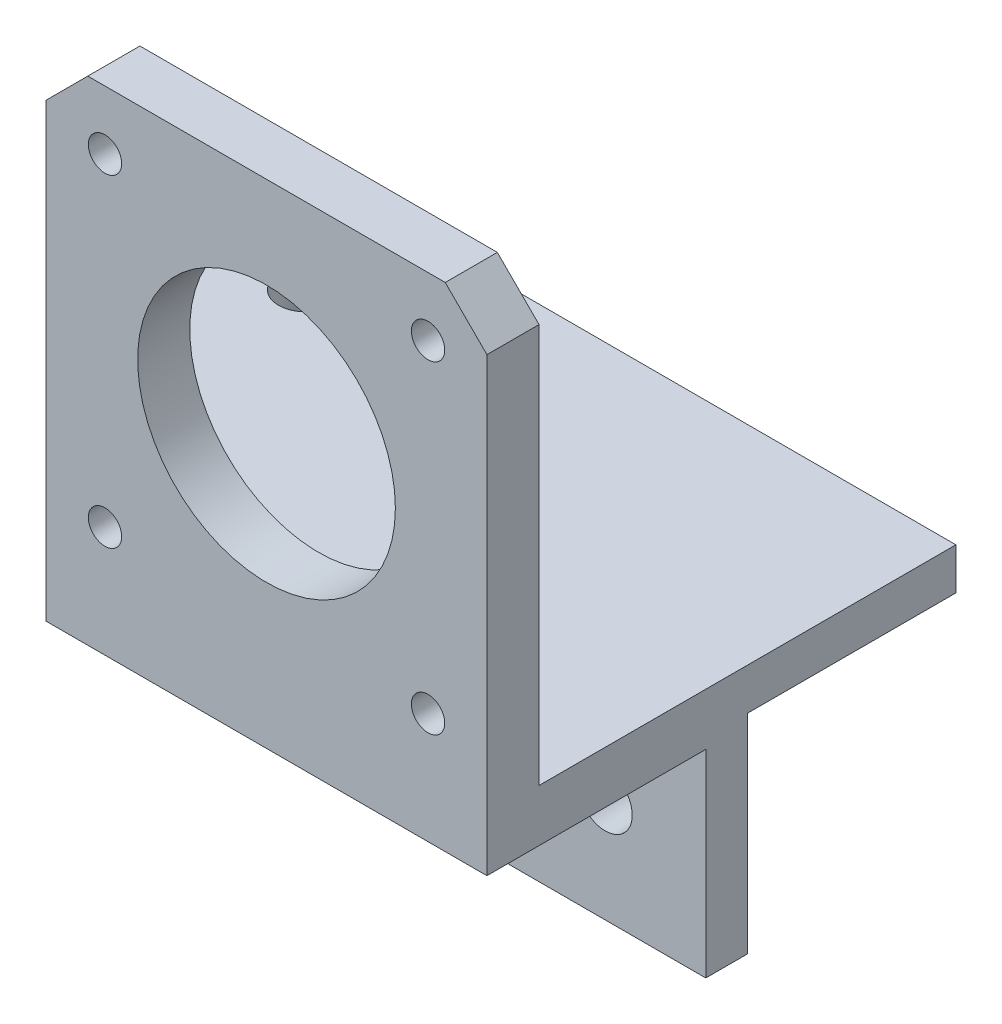
ISO-10303-21;
HEADER;
FILE_DESCRIPTION(('STEP AP214'),'2;1');
FILE_NAME('part.step','',(''),(''),'','','');
FILE_SCHEMA(('AUTOMOTIVE_DESIGN { 1 0 10303 214 1 1 1 1 }'));
ENDSEC;
DATA;
#1=APPLICATION_CONTEXT('core data for automotive mechanical design processes');
#2=APPLICATION_PROTOCOL_DEFINITION('international standard','automotive_design',2000,#1);
#3=PRODUCT_CONTEXT('',#1,'mechanical');
#4=PRODUCT('Part','Part','',(#3));
#5=PRODUCT_RELATED_PRODUCT_CATEGORY('part','',(#4));
#6=PRODUCT_DEFINITION_FORMATION('','',#4);
#7=PRODUCT_DEFINITION_CONTEXT('part definition',#1,'design');
#8=PRODUCT_DEFINITION('design','',#6,#7);
#9=PRODUCT_DEFINITION_SHAPE('','',#8);
#10=(LENGTH_UNIT() NAMED_UNIT(*) SI_UNIT(.MILLI.,.METRE.));
#11=(NAMED_UNIT(*) PLANE_ANGLE_UNIT() SI_UNIT($,.RADIAN.));
#12=(NAMED_UNIT(*) SI_UNIT($,.STERADIAN.) SOLID_ANGLE_UNIT());
#13=UNCERTAINTY_MEASURE_WITH_UNIT(LENGTH_MEASURE(1.E-05),#10,'distance_accuracy_value','');
#14=(GEOMETRIC_REPRESENTATION_CONTEXT(3) GLOBAL_UNCERTAINTY_ASSIGNED_CONTEXT((#13)) GLOBAL_UNIT_ASSIGNED_CONTEXT((#10,
#11,#12)) REPRESENTATION_CONTEXT('',''));
#15=CARTESIAN_POINT('',(0.,0.,0.));
#16=DIRECTION('',(0.,0.,1.));
#17=DIRECTION('',(1.,0.,0.));
#18=AXIS2_PLACEMENT_3D('',#15,#16,#17);
#19=CARTESIAN_POINT('',(0.,0.,0.));
#20=DIRECTION('',(0.,0.,1.));
#21=DIRECTION('',(1.,0.,0.));
#22=AXIS2_PLACEMENT_3D('',#19,#20,#21);
#23=PLANE('',#22);
#24=CARTESIAN_POINT('',(-49.6556066891385,-2.97105977085421,0.));
#25=DIRECTION('',(0.,0.,1.));
#26=DIRECTION('',(1.,0.,0.));
#27=AXIS2_PLACEMENT_3D('',#24,#25,#26);
#28=CIRCLE('',#27,2.6);
#29=CARTESIAN_POINT('',(-47.0556066891385,-2.97105977085421,0.));
#30=VERTEX_POINT('',#29);
#31=EDGE_CURVE('E176',#30,#30,#28,.T.);
#32=ORIENTED_EDGE('',*,*,#31,.T.);
#33=EDGE_LOOP('',(#32));
#34=FACE_BOUND('',#33,.T.);
#35=CARTESIAN_POINT('',(-69.6556066891385,-2.97105977085421,0.));
#36=DIRECTION('',(0.,0.,1.));
#37=DIRECTION('',(1.,0.,0.));
#38=AXIS2_PLACEMENT_3D('',#35,#36,#37);
#39=CIRCLE('',#38,2.6);
#40=CARTESIAN_POINT('',(-67.0556066891385,-2.97105977085421,0.));
#41=VERTEX_POINT('',#40);
#42=EDGE_CURVE('E170',#41,#41,#39,.T.);
#43=ORIENTED_EDGE('',*,*,#42,.T.);
#44=EDGE_LOOP('',(#43));
#45=FACE_BOUND('',#44,.T.);
#46=CARTESIAN_POINT('',(-89.6556066891385,-2.97105977085421,0.));
#47=DIRECTION('',(0.,0.,1.));
#48=DIRECTION('',(1.,0.,0.));
#49=AXIS2_PLACEMENT_3D('',#46,#47,#48);
#50=CIRCLE('',#49,2.6);
#51=CARTESIAN_POINT('',(-87.0556066891385,-2.97105977085421,0.));
#52=VERTEX_POINT('',#51);
#53=EDGE_CURVE('E163',#52,#52,#50,.T.);
#54=ORIENTED_EDGE('',*,*,#53,.T.);
#55=EDGE_LOOP('',(#54));
#56=FACE_BOUND('',#55,.T.);
#57=DIRECTION('',(-1.,0.,0.));
#58=VECTOR('',#57,1.);
#59=CARTESIAN_POINT('',(-40.,7.02894022914576,0.));
#60=LINE('',#59,#58);
#61=CARTESIAN_POINT('',(-40.,7.02894022914576,0.));
#62=VERTEX_POINT('',#61);
#63=CARTESIAN_POINT('',(-102.391596743468,7.02894022914576,0.));
#64=VERTEX_POINT('',#63);
#65=EDGE_CURVE('E48',#62,#64,#60,.T.);
#66=ORIENTED_EDGE('',*,*,#65,.F.);
#67=DIRECTION('',(0.,1.,0.));
#68=VECTOR('',#67,1.);
#69=CARTESIAN_POINT('',(-40.,-12.9710597708542,0.));
#70=LINE('',#69,#68);
#71=CARTESIAN_POINT('',(-40.,-12.9710597708542,0.));
#72=VERTEX_POINT('',#71);
#73=EDGE_CURVE('E135',#72,#62,#70,.T.);
#74=ORIENTED_EDGE('',*,*,#73,.F.);
#75=DIRECTION('',(1.,0.,0.));
#76=VECTOR('',#75,1.);
#77=CARTESIAN_POINT('',(-40.,-12.9710597708542,0.));
#78=LINE('',#77,#76);
#79=CARTESIAN_POINT('',(-102.391596743468,-12.9710597708542,0.));
#80=VERTEX_POINT('',#79);
#81=EDGE_CURVE('E131',#80,#72,#78,.T.);
#82=ORIENTED_EDGE('',*,*,#81,.F.);
#83=DIRECTION('',(0.,-1.,0.));
#84=VECTOR('',#83,1.);
#85=CARTESIAN_POINT('',(-102.391596743468,-12.9710597708542,0.));
#86=LINE('',#85,#84);
#87=EDGE_CURVE('E129',#64,#80,#86,.T.);
#88=ORIENTED_EDGE('',*,*,#87,.F.);
#89=EDGE_LOOP('',(#66,#74,#82,#88));
#90=FACE_BOUND('',#89,.T.);
#91=ADVANCED_FACE('F33',(#34,#45,#56,#90),#23,.F.);
#92=CARTESIAN_POINT('',(-40.,-12.9710597708542,4.));
#93=DIRECTION('',(-1.,0.,0.));
#94=DIRECTION('',(0.,0.,1.));
#95=AXIS2_PLACEMENT_3D('',#92,#93,#94);
#96=PLANE('',#95);
#97=ORIENTED_EDGE('',*,*,#73,.T.);
#98=DIRECTION('',(0.,0.,1.));
#99=VECTOR('',#98,1.);
#100=CARTESIAN_POINT('',(-40.,7.02894022914576,-82.5196876527666));
#101=LINE('',#100,#99);
#102=CARTESIAN_POINT('',(-40.,7.02894022914576,-20.));
#103=VERTEX_POINT('',#102);
#104=EDGE_CURVE('E145',#103,#62,#101,.T.);
#105=ORIENTED_EDGE('',*,*,#104,.F.);
#106=DIRECTION('',(0.,1.,0.));
#107=VECTOR('',#106,1.);
#108=CARTESIAN_POINT('',(-40.,11.0289402291458,-20.));
#109=LINE('',#108,#107);
#110=CARTESIAN_POINT('',(-40.,11.0289402291458,-20.));
#111=VERTEX_POINT('',#110);
#112=EDGE_CURVE('E156',#103,#111,#109,.T.);
#113=ORIENTED_EDGE('',*,*,#112,.T.);
#114=DIRECTION('',(0.,0.,-1.));
#115=VECTOR('',#114,1.);
#116=CARTESIAN_POINT('',(-40.,11.0289402291458,4.));
#117=LINE('',#116,#115);
#118=CARTESIAN_POINT('',(-40.,11.0289402291458,20.));
#119=VERTEX_POINT('',#118);
#120=EDGE_CURVE('E276',#119,#111,#117,.T.);
#121=ORIENTED_EDGE('',*,*,#120,.F.);
#122=DIRECTION('',(0.,1.,0.));
#123=VECTOR('',#122,1.);
#124=CARTESIAN_POINT('',(-40.,6.02894022914577,20.));
#125=LINE('',#124,#123);
#126=CARTESIAN_POINT('',(-40.0000000000001,49.3289402291458,20.));
#127=VERTEX_POINT('',#126);
#128=EDGE_CURVE('E209',#119,#127,#125,.T.);
#129=ORIENTED_EDGE('',*,*,#128,.T.);
#130=DIRECTION('',(0.,0.,-1.));
#131=VECTOR('',#130,1.);
#132=CARTESIAN_POINT('',(-40.0000000000001,49.3289402291458,25.));
#133=LINE('',#132,#131);
#134=CARTESIAN_POINT('',(-40.0000000000001,49.3289402291458,25.));
#135=VERTEX_POINT('',#134);
#136=EDGE_CURVE('E246',#135,#127,#133,.T.);
#137=ORIENTED_EDGE('',*,*,#136,.F.);
#138=DIRECTION('',(0.,1.,0.));
#139=VECTOR('',#138,1.);
#140=CARTESIAN_POINT('',(-40.,6.02894022914577,25.));
#141=LINE('',#140,#139);
#142=CARTESIAN_POINT('',(-40.,6.02894022914577,25.));
#143=VERTEX_POINT('',#142);
#144=EDGE_CURVE('E212',#143,#135,#141,.T.);
#145=ORIENTED_EDGE('',*,*,#144,.F.);
#146=DIRECTION('',(0.,0.,-1.));
#147=VECTOR('',#146,1.);
#148=CARTESIAN_POINT('',(-40.,6.02894022914577,62.5944832108573));
#149=LINE('',#148,#147);
#150=CARTESIAN_POINT('',(-40.,6.02894022914576,4.));
#151=VERTEX_POINT('',#150);
#152=EDGE_CURVE('E249',#143,#151,#149,.T.);
#153=ORIENTED_EDGE('',*,*,#152,.T.);
#154=DIRECTION('',(0.,1.,0.));
#155=VECTOR('',#154,1.);
#156=CARTESIAN_POINT('',(-40.,-12.9710597708542,4.));
#157=LINE('',#156,#155);
#158=CARTESIAN_POINT('',(-40.,-12.9710597708542,4.));
#159=VERTEX_POINT('',#158);
#160=EDGE_CURVE('E259',#159,#151,#157,.T.);
#161=ORIENTED_EDGE('',*,*,#160,.F.);
#162=DIRECTION('',(0.,0.,-1.));
#163=VECTOR('',#162,1.);
#164=CARTESIAN_POINT('',(-40.,-12.9710597708542,4.));
#165=LINE('',#164,#163);
#166=EDGE_CURVE('E267',#159,#72,#165,.T.);
#167=ORIENTED_EDGE('',*,*,#166,.T.);
#168=EDGE_LOOP('',(#97,#105,#113,#121,#129,#137,#145,#153,#161,#167));
#169=FACE_BOUND('',#168,.T.);
#170=ADVANCED_FACE('F303',(#169),#96,.F.);
#171=CARTESIAN_POINT('',(-40.,11.0289402291458,4.));
#172=DIRECTION('',(0.,-1.,0.));
#173=DIRECTION('',(0.,0.,-1.));
#174=AXIS2_PLACEMENT_3D('',#171,#172,#173);
#175=PLANE('',#174);
#176=CARTESIAN_POINT('',(-92.3915967434677,11.0289402291458,-10.));
#177=DIRECTION('',(0.,1.,0.));
#178=DIRECTION('',(0.,0.,1.));
#179=AXIS2_PLACEMENT_3D('',#176,#177,#178);
#180=CIRCLE('',#179,2.6);
#181=CARTESIAN_POINT('',(-92.3915967434677,11.0289402291458,-7.4));
#182=VERTEX_POINT('',#181);
#183=EDGE_CURVE('E153',#182,#182,#180,.T.);
#184=ORIENTED_EDGE('',*,*,#183,.F.);
#185=EDGE_LOOP('',(#184));
#186=FACE_BOUND('',#185,.T.);
#187=ORIENTED_EDGE('',*,*,#120,.T.);
#188=DIRECTION('',(-1.,0.,0.));
#189=VECTOR('',#188,1.);
#190=CARTESIAN_POINT('',(-40.,11.0289402291458,-20.));
#191=LINE('',#190,#189);
#192=CARTESIAN_POINT('',(-102.391596743468,11.0289402291458,-20.));
#193=VERTEX_POINT('',#192);
#194=EDGE_CURVE('E160',#111,#193,#191,.T.);
#195=ORIENTED_EDGE('',*,*,#194,.T.);
#196=DIRECTION('',(0.,0.,-1.));
#197=VECTOR('',#196,1.);
#198=CARTESIAN_POINT('',(-102.391596743468,11.0289402291458,4.));
#199=LINE('',#198,#197);
#200=CARTESIAN_POINT('',(-102.391596743468,11.0289402291458,4.));
#201=VERTEX_POINT('',#200);
#202=EDGE_CURVE('E274',#201,#193,#199,.T.);
#203=ORIENTED_EDGE('',*,*,#202,.F.);
#204=DIRECTION('',(-1.,0.,0.));
#205=VECTOR('',#204,1.);
#206=CARTESIAN_POINT('',(-40.,11.0289402291458,4.));
#207=LINE('',#206,#205);
#208=CARTESIAN_POINT('',(-98.3,11.0289402291458,4.));
#209=VERTEX_POINT('',#208);
#210=EDGE_CURVE('E261',#209,#201,#207,.T.);
#211=ORIENTED_EDGE('',*,*,#210,.F.);
#212=DIRECTION('',(0.707106781186544,0.,0.707106781186551));
#213=VECTOR('',#212,1.);
#214=CARTESIAN_POINT('',(-69.1500000000003,11.0289402291458,33.15));
#215=LINE('',#214,#213);
#216=CARTESIAN_POINT('',(-82.3,11.0289402291458,20.));
#217=VERTEX_POINT('',#216);
#218=EDGE_CURVE('E11',#209,#217,#215,.T.);
#219=ORIENTED_EDGE('',*,*,#218,.T.);
#220=DIRECTION('',(-1.,0.,0.));
#221=VECTOR('',#220,1.);
#222=CARTESIAN_POINT('',(-40.,11.0289402291458,20.));
#223=LINE('',#222,#221);
#224=EDGE_CURVE('E251',#119,#217,#223,.T.);
#225=ORIENTED_EDGE('',*,*,#224,.F.);
#226=EDGE_LOOP('',(#187,#195,#203,#211,#219,#225));
#227=FACE_BOUND('',#226,.T.);
#228=ADVANCED_FACE('F293',(#186,#227),#175,.F.);
#229=CARTESIAN_POINT('',(-102.391596743468,-12.9710597708542,4.));
#230=DIRECTION('',(1.,0.,0.));
#231=DIRECTION('',(0.,0.,-1.));
#232=AXIS2_PLACEMENT_3D('',#229,#230,#231);
#233=PLANE('',#232);
#234=ORIENTED_EDGE('',*,*,#202,.T.);
#235=DIRECTION('',(0.,-1.,0.));
#236=VECTOR('',#235,1.);
#237=CARTESIAN_POINT('',(-102.391596743468,11.0289402291458,-20.));
#238=LINE('',#237,#236);
#239=CARTESIAN_POINT('',(-102.391596743468,7.02894022914576,-20.));
#240=VERTEX_POINT('',#239);
#241=EDGE_CURVE('E142',#193,#240,#238,.T.);
#242=ORIENTED_EDGE('',*,*,#241,.T.);
#243=DIRECTION('',(0.,0.,1.));
#244=VECTOR('',#243,1.);
#245=CARTESIAN_POINT('',(-102.391596743468,7.02894022914576,-82.5196876527666));
#246=LINE('',#245,#244);
#247=EDGE_CURVE('E139',#240,#64,#246,.T.);
#248=ORIENTED_EDGE('',*,*,#247,.T.);
#249=ORIENTED_EDGE('',*,*,#87,.T.);
#250=DIRECTION('',(0.,0.,-1.));
#251=VECTOR('',#250,1.);
#252=CARTESIAN_POINT('',(-102.391596743468,-12.9710597708542,4.));
#253=LINE('',#252,#251);
#254=CARTESIAN_POINT('',(-102.391596743468,-12.9710597708542,4.));
#255=VERTEX_POINT('',#254);
#256=EDGE_CURVE('E272',#255,#80,#253,.T.);
#257=ORIENTED_EDGE('',*,*,#256,.F.);
#258=DIRECTION('',(0.,-1.,0.));
#259=VECTOR('',#258,1.);
#260=CARTESIAN_POINT('',(-102.391596743468,-12.9710597708542,4.));
#261=LINE('',#260,#259);
#262=EDGE_CURVE('E263',#201,#255,#261,.T.);
#263=ORIENTED_EDGE('',*,*,#262,.F.);
#264=EDGE_LOOP('',(#234,#242,#248,#249,#257,#263));
#265=FACE_BOUND('',#264,.T.);
#266=ADVANCED_FACE('F140',(#265),#233,.F.);
#267=CARTESIAN_POINT('',(-40.,-12.9710597708542,4.));
#268=DIRECTION('',(0.,1.,0.));
#269=DIRECTION('',(0.,0.,1.));
#270=AXIS2_PLACEMENT_3D('',#267,#268,#269);
#271=PLANE('',#270);
#272=ORIENTED_EDGE('',*,*,#81,.T.);
#273=ORIENTED_EDGE('',*,*,#166,.F.);
#274=DIRECTION('',(1.,0.,0.));
#275=VECTOR('',#274,1.);
#276=CARTESIAN_POINT('',(-40.,-12.9710597708542,4.));
#277=LINE('',#276,#275);
#278=EDGE_CURVE('E265',#255,#159,#277,.T.);
#279=ORIENTED_EDGE('',*,*,#278,.F.);
#280=ORIENTED_EDGE('',*,*,#256,.T.);
#281=EDGE_LOOP('',(#272,#273,#279,#280));
#282=FACE_BOUND('',#281,.T.);
#283=ADVANCED_FACE('F301',(#282),#271,.F.);
#284=CARTESIAN_POINT('',(0.,0.,4.));
#285=DIRECTION('',(0.,0.,1.));
#286=DIRECTION('',(1.,0.,0.));
#287=AXIS2_PLACEMENT_3D('',#284,#285,#286);
#288=PLANE('',#287);
#289=CARTESIAN_POINT('',(-89.6556066891385,-2.97105977085421,4.));
#290=DIRECTION('',(0.,0.,1.));
#291=DIRECTION('',(1.,0.,0.));
#292=AXIS2_PLACEMENT_3D('',#289,#290,#291);
#293=CIRCLE('',#292,2.6);
#294=CARTESIAN_POINT('',(-87.0556066891385,-2.97105977085421,4.));
#295=VERTEX_POINT('',#294);
#296=EDGE_CURVE('E167',#295,#295,#293,.T.);
#297=ORIENTED_EDGE('',*,*,#296,.F.);
#298=EDGE_LOOP('',(#297));
#299=FACE_BOUND('',#298,.T.);
#300=CARTESIAN_POINT('',(-69.6556066891385,-2.97105977085421,4.));
#301=DIRECTION('',(0.,0.,1.));
#302=DIRECTION('',(1.,0.,0.));
#303=AXIS2_PLACEMENT_3D('',#300,#301,#302);
#304=CIRCLE('',#303,2.6);
#305=CARTESIAN_POINT('',(-67.0556066891385,-2.97105977085421,4.));
#306=VERTEX_POINT('',#305);
#307=EDGE_CURVE('E173',#306,#306,#304,.T.);
#308=ORIENTED_EDGE('',*,*,#307,.F.);
#309=EDGE_LOOP('',(#308));
#310=FACE_BOUND('',#309,.T.);
#311=CARTESIAN_POINT('',(-49.6556066891385,-2.97105977085421,4.));
#312=DIRECTION('',(0.,0.,1.));
#313=DIRECTION('',(1.,0.,0.));
#314=AXIS2_PLACEMENT_3D('',#311,#312,#313);
#315=CIRCLE('',#314,2.6);
#316=CARTESIAN_POINT('',(-47.0556066891385,-2.97105977085421,4.));
#317=VERTEX_POINT('',#316);
#318=EDGE_CURVE('E179',#317,#317,#315,.T.);
#319=ORIENTED_EDGE('',*,*,#318,.F.);
#320=EDGE_LOOP('',(#319));
#321=FACE_BOUND('',#320,.T.);
#322=DIRECTION('',(1.,0.,0.));
#323=VECTOR('',#322,1.);
#324=CARTESIAN_POINT('',(-40.,6.02894022914577,4.));
#325=LINE('',#324,#323);
#326=CARTESIAN_POINT('',(-98.3,6.02894022914577,4.));
#327=VERTEX_POINT('',#326);
#328=EDGE_CURVE('E56',#327,#151,#325,.T.);
#329=ORIENTED_EDGE('',*,*,#328,.F.);
#330=DIRECTION('',(0.,1.,0.));
#331=VECTOR('',#330,1.);
#332=CARTESIAN_POINT('',(-98.3,0.,4.));
#333=LINE('',#332,#331);
#334=EDGE_CURVE('E281',#327,#209,#333,.T.);
#335=ORIENTED_EDGE('',*,*,#334,.T.);
#336=ORIENTED_EDGE('',*,*,#210,.T.);
#337=ORIENTED_EDGE('',*,*,#262,.T.);
#338=ORIENTED_EDGE('',*,*,#278,.T.);
#339=ORIENTED_EDGE('',*,*,#160,.T.);
#340=EDGE_LOOP('',(#329,#335,#336,#337,#338,#339));
#341=FACE_BOUND('',#340,.T.);
#342=ADVANCED_FACE('F290',(#299,#310,#321,#341),#288,.T.);
#343=CARTESIAN_POINT('',(-82.3,11.0289402291458,62.5944832108573));
#344=DIRECTION('',(1.,0.,0.));
#345=DIRECTION('',(0.,0.,-1.));
#346=AXIS2_PLACEMENT_3D('',#343,#344,#345);
#347=PLANE('',#346);
#348=DIRECTION('',(0.,-1.,0.));
#349=VECTOR('',#348,1.);
#350=CARTESIAN_POINT('',(-82.3,6.02894022914577,20.));
#351=LINE('',#350,#349);
#352=CARTESIAN_POINT('',(-82.3,49.3289402291458,20.));
#353=VERTEX_POINT('',#352);
#354=EDGE_CURVE('E216',#353,#217,#351,.T.);
#355=ORIENTED_EDGE('',*,*,#354,.T.);
#356=DIRECTION('',(0.,-1.,0.));
#357=VECTOR('',#356,1.);
#358=CARTESIAN_POINT('',(-82.3,11.0289402291458,20.0000000000001));
#359=LINE('',#358,#357);
#360=CARTESIAN_POINT('',(-82.3,6.02894022914577,20.0000000000001));
#361=VERTEX_POINT('',#360);
#362=EDGE_CURVE('E278',#217,#361,#359,.T.);
#363=ORIENTED_EDGE('',*,*,#362,.T.);
#364=DIRECTION('',(0.,0.,-1.));
#365=VECTOR('',#364,1.);
#366=CARTESIAN_POINT('',(-82.3,6.02894022914577,62.5944832108573));
#367=LINE('',#366,#365);
#368=CARTESIAN_POINT('',(-82.3,6.02894022914577,25.));
#369=VERTEX_POINT('',#368);
#370=EDGE_CURVE('E252',#369,#361,#367,.T.);
#371=ORIENTED_EDGE('',*,*,#370,.F.);
#372=DIRECTION('',(0.,-1.,0.));
#373=VECTOR('',#372,1.);
#374=CARTESIAN_POINT('',(-82.3,6.02894022914577,25.));
#375=LINE('',#374,#373);
#376=CARTESIAN_POINT('',(-82.3,49.3289402291458,25.));
#377=VERTEX_POINT('',#376);
#378=EDGE_CURVE('E222',#377,#369,#375,.T.);
#379=ORIENTED_EDGE('',*,*,#378,.F.);
#380=DIRECTION('',(0.,0.,-1.));
#381=VECTOR('',#380,1.);
#382=CARTESIAN_POINT('',(-82.3,49.3289402291458,25.));
#383=LINE('',#382,#381);
#384=EDGE_CURVE('E228',#377,#353,#383,.T.);
#385=ORIENTED_EDGE('',*,*,#384,.T.);
#386=EDGE_LOOP('',(#355,#363,#371,#379,#385));
#387=FACE_BOUND('',#386,.T.);
#388=ADVANCED_FACE('F313',(#387),#347,.F.);
#389=CARTESIAN_POINT('',(-40.,6.02894022914577,62.5944832108573));
#390=DIRECTION('',(0.,1.,0.));
#391=DIRECTION('',(-1.,0.,0.));
#392=AXIS2_PLACEMENT_3D('',#389,#390,#391);
#393=PLANE('',#392);
#394=ORIENTED_EDGE('',*,*,#152,.F.);
#395=DIRECTION('',(1.,0.,0.));
#396=VECTOR('',#395,1.);
#397=CARTESIAN_POINT('',(-40.,6.02894022914577,25.));
#398=LINE('',#397,#396);
#399=EDGE_CURVE('E225',#369,#143,#398,.T.);
#400=ORIENTED_EDGE('',*,*,#399,.F.);
#401=ORIENTED_EDGE('',*,*,#370,.T.);
#402=DIRECTION('',(-0.707106781186544,0.,-0.707106781186551));
#403=VECTOR('',#402,1.);
#404=CARTESIAN_POINT('',(-39.8527583945717,6.02894022914577,62.4472416054289));
#405=LINE('',#404,#403);
#406=EDGE_CURVE('E41',#361,#327,#405,.T.);
#407=ORIENTED_EDGE('',*,*,#406,.T.);
#408=ORIENTED_EDGE('',*,*,#328,.T.);
#409=EDGE_LOOP('',(#394,#400,#401,#407,#408));
#410=FACE_BOUND('',#409,.T.);
#411=ADVANCED_FACE('F284',(#410),#393,.F.);
#412=CARTESIAN_POINT('',(0.,0.,20.));
#413=DIRECTION('',(0.,0.,1.));
#414=DIRECTION('',(1.,0.,0.));
#415=AXIS2_PLACEMENT_3D('',#412,#413,#414);
#416=PLANE('',#415);
#417=CARTESIAN_POINT('',(-45.65,47.6789402291458,20.));
#418=DIRECTION('',(0.,0.,1.));
#419=DIRECTION('',(1.,0.,0.));
#420=AXIS2_PLACEMENT_3D('',#417,#418,#419);
#421=CIRCLE('',#420,1.6);
#422=CARTESIAN_POINT('',(-44.05,47.6789402291458,20.));
#423=VERTEX_POINT('',#422);
#424=EDGE_CURVE('E203',#423,#423,#421,.T.);
#425=ORIENTED_EDGE('',*,*,#424,.T.);
#426=EDGE_LOOP('',(#425));
#427=FACE_BOUND('',#426,.T.);
#428=CARTESIAN_POINT('',(-61.15,32.1789402291458,20.));
#429=DIRECTION('',(0.,0.,1.));
#430=DIRECTION('',(1.,0.,0.));
#431=AXIS2_PLACEMENT_3D('',#428,#429,#430);
#432=CIRCLE('',#431,12.3643409800213);
#433=CARTESIAN_POINT('',(-48.7856590199787,32.1789402291458,20.));
#434=VERTEX_POINT('',#433);
#435=EDGE_CURVE('E197',#434,#434,#432,.T.);
#436=ORIENTED_EDGE('',*,*,#435,.T.);
#437=EDGE_LOOP('',(#436));
#438=FACE_BOUND('',#437,.T.);
#439=CARTESIAN_POINT('',(-76.65,47.6789402291456,20.));
#440=DIRECTION('',(0.,0.,1.));
#441=DIRECTION('',(1.,0.,0.));
#442=AXIS2_PLACEMENT_3D('',#439,#440,#441);
#443=CIRCLE('',#442,1.6);
#444=CARTESIAN_POINT('',(-75.05,47.6789402291456,20.));
#445=VERTEX_POINT('',#444);
#446=EDGE_CURVE('E191',#445,#445,#443,.T.);
#447=ORIENTED_EDGE('',*,*,#446,.T.);
#448=EDGE_LOOP('',(#447));
#449=FACE_BOUND('',#448,.T.);
#450=CARTESIAN_POINT('',(-76.6499999999997,16.6789402291456,20.));
#451=DIRECTION('',(0.,0.,1.));
#452=DIRECTION('',(1.,0.,0.));
#453=AXIS2_PLACEMENT_3D('',#450,#451,#452);
#454=CIRCLE('',#453,1.6);
#455=CARTESIAN_POINT('',(-75.0499999999997,16.6789402291456,20.));
#456=VERTEX_POINT('',#455);
#457=EDGE_CURVE('E185',#456,#456,#454,.T.);
#458=ORIENTED_EDGE('',*,*,#457,.T.);
#459=EDGE_LOOP('',(#458));
#460=FACE_BOUND('',#459,.T.);
#461=CARTESIAN_POINT('',(-45.6499999999997,16.6789402291458,20.));
#462=DIRECTION('',(0.,0.,1.));
#463=DIRECTION('',(1.,0.,0.));
#464=AXIS2_PLACEMENT_3D('',#461,#462,#463);
#465=CIRCLE('',#464,1.6);
#466=CARTESIAN_POINT('',(-44.0499999999997,16.6789402291458,20.));
#467=VERTEX_POINT('',#466);
#468=EDGE_CURVE('E166',#467,#467,#465,.T.);
#469=ORIENTED_EDGE('',*,*,#468,.T.);
#470=EDGE_LOOP('',(#469));
#471=FACE_BOUND('',#470,.T.);
#472=ORIENTED_EDGE('',*,*,#128,.F.);
#473=ORIENTED_EDGE('',*,*,#224,.T.);
#474=ORIENTED_EDGE('',*,*,#354,.F.);
#475=DIRECTION('',(-0.707106781186547,-0.707106781186547,0.));
#476=VECTOR('',#475,1.);
#477=CARTESIAN_POINT('',(-78.3000000000001,53.3289402291457,20.));
#478=LINE('',#477,#476);
#479=CARTESIAN_POINT('',(-78.3000000000001,53.3289402291457,20.));
#480=VERTEX_POINT('',#479);
#481=EDGE_CURVE('E234',#480,#353,#478,.T.);
#482=ORIENTED_EDGE('',*,*,#481,.F.);
#483=DIRECTION('',(-1.,0.,0.));
#484=VECTOR('',#483,1.);
#485=CARTESIAN_POINT('',(-44.,53.3289402291458,20.));
#486=LINE('',#485,#484);
#487=CARTESIAN_POINT('',(-44.,53.3289402291458,20.));
#488=VERTEX_POINT('',#487);
#489=EDGE_CURVE('E232',#488,#480,#486,.T.);
#490=ORIENTED_EDGE('',*,*,#489,.F.);
#491=DIRECTION('',(-0.707106781186548,0.707106781186547,0.));
#492=VECTOR('',#491,1.);
#493=CARTESIAN_POINT('',(-40.0000000000001,49.3289402291458,20.));
#494=LINE('',#493,#492);
#495=EDGE_CURVE('E230',#127,#488,#494,.T.);
#496=ORIENTED_EDGE('',*,*,#495,.F.);
#497=EDGE_LOOP('',(#472,#473,#474,#482,#490,#496));
#498=FACE_BOUND('',#497,.T.);
#499=ADVANCED_FACE('F318',(#427,#438,#449,#460,#471,#498),#416,.F.);
#500=CARTESIAN_POINT('',(0.,0.,25.));
#501=DIRECTION('',(0.,0.,1.));
#502=DIRECTION('',(1.,0.,0.));
#503=AXIS2_PLACEMENT_3D('',#500,#501,#502);
#504=PLANE('',#503);
#505=CARTESIAN_POINT('',(-76.6499999999997,16.6789402291456,25.));
#506=DIRECTION('',(0.,0.,1.));
#507=DIRECTION('',(1.,0.,0.));
#508=AXIS2_PLACEMENT_3D('',#505,#506,#507);
#509=CIRCLE('',#508,1.6);
#510=CARTESIAN_POINT('',(-75.0499999999997,16.6789402291456,25.));
#511=VERTEX_POINT('',#510);
#512=EDGE_CURVE('E188',#511,#511,#509,.T.);
#513=ORIENTED_EDGE('',*,*,#512,.F.);
#514=EDGE_LOOP('',(#513));
#515=FACE_BOUND('',#514,.T.);
#516=CARTESIAN_POINT('',(-61.15,32.1789402291458,25.));
#517=DIRECTION('',(0.,0.,1.));
#518=DIRECTION('',(1.,0.,0.));
#519=AXIS2_PLACEMENT_3D('',#516,#517,#518);
#520=CIRCLE('',#519,12.3643409800213);
#521=CARTESIAN_POINT('',(-48.7856590199787,32.1789402291458,25.));
#522=VERTEX_POINT('',#521);
#523=EDGE_CURVE('E200',#522,#522,#520,.T.);
#524=ORIENTED_EDGE('',*,*,#523,.F.);
#525=EDGE_LOOP('',(#524));
#526=FACE_BOUND('',#525,.T.);
#527=ORIENTED_EDGE('',*,*,#144,.T.);
#528=DIRECTION('',(-0.707106781186548,0.707106781186547,0.));
#529=VECTOR('',#528,1.);
#530=CARTESIAN_POINT('',(-40.0000000000001,49.3289402291458,25.));
#531=LINE('',#530,#529);
#532=CARTESIAN_POINT('',(-44.,53.3289402291458,25.));
#533=VERTEX_POINT('',#532);
#534=EDGE_CURVE('E215',#135,#533,#531,.T.);
#535=ORIENTED_EDGE('',*,*,#534,.T.);
#536=DIRECTION('',(-1.,0.,0.));
#537=VECTOR('',#536,1.);
#538=CARTESIAN_POINT('',(-44.,53.3289402291458,25.));
#539=LINE('',#538,#537);
#540=CARTESIAN_POINT('',(-78.3000000000001,53.3289402291457,25.));
#541=VERTEX_POINT('',#540);
#542=EDGE_CURVE('E218',#533,#541,#539,.T.);
#543=ORIENTED_EDGE('',*,*,#542,.T.);
#544=DIRECTION('',(-0.707106781186547,-0.707106781186547,0.));
#545=VECTOR('',#544,1.);
#546=CARTESIAN_POINT('',(-78.3000000000001,53.3289402291457,25.));
#547=LINE('',#546,#545);
#548=EDGE_CURVE('E220',#541,#377,#547,.T.);
#549=ORIENTED_EDGE('',*,*,#548,.T.);
#550=ORIENTED_EDGE('',*,*,#378,.T.);
#551=ORIENTED_EDGE('',*,*,#399,.T.);
#552=EDGE_LOOP('',(#527,#535,#543,#549,#550,#551));
#553=FACE_BOUND('',#552,.T.);
#554=CARTESIAN_POINT('',(-45.65,47.6789402291458,25.));
#555=DIRECTION('',(0.,0.,1.));
#556=DIRECTION('',(1.,0.,0.));
#557=AXIS2_PLACEMENT_3D('',#554,#555,#556);
#558=CIRCLE('',#557,1.6);
#559=CARTESIAN_POINT('',(-44.05,47.6789402291458,25.));
#560=VERTEX_POINT('',#559);
#561=EDGE_CURVE('E206',#560,#560,#558,.T.);
#562=ORIENTED_EDGE('',*,*,#561,.F.);
#563=EDGE_LOOP('',(#562));
#564=FACE_BOUND('',#563,.T.);
#565=CARTESIAN_POINT('',(-76.65,47.6789402291456,25.));
#566=DIRECTION('',(0.,0.,1.));
#567=DIRECTION('',(1.,0.,0.));
#568=AXIS2_PLACEMENT_3D('',#565,#566,#567);
#569=CIRCLE('',#568,1.6);
#570=CARTESIAN_POINT('',(-75.05,47.6789402291456,25.));
#571=VERTEX_POINT('',#570);
#572=EDGE_CURVE('E194',#571,#571,#569,.T.);
#573=ORIENTED_EDGE('',*,*,#572,.F.);
#574=EDGE_LOOP('',(#573));
#575=FACE_BOUND('',#574,.T.);
#576=CARTESIAN_POINT('',(-45.6499999999997,16.6789402291458,25.));
#577=DIRECTION('',(0.,0.,1.));
#578=DIRECTION('',(1.,0.,0.));
#579=AXIS2_PLACEMENT_3D('',#576,#577,#578);
#580=CIRCLE('',#579,1.6);
#581=CARTESIAN_POINT('',(-44.0499999999997,16.6789402291458,25.));
#582=VERTEX_POINT('',#581);
#583=EDGE_CURVE('E182',#582,#582,#580,.T.);
#584=ORIENTED_EDGE('',*,*,#583,.F.);
#585=EDGE_LOOP('',(#584));
#586=FACE_BOUND('',#585,.T.);
#587=ADVANCED_FACE('F307',(#515,#526,#553,#564,#575,#586),#504,.T.);
#588=CARTESIAN_POINT('',(-40.0000000000001,49.3289402291458,25.));
#589=DIRECTION('',(-0.707106781186547,-0.707106781186548,0.));
#590=DIRECTION('',(0.707106781186548,-0.707106781186547,0.));
#591=AXIS2_PLACEMENT_3D('',#588,#589,#590);
#592=PLANE('',#591);
#593=ORIENTED_EDGE('',*,*,#495,.T.);
#594=DIRECTION('',(0.,0.,-1.));
#595=VECTOR('',#594,1.);
#596=CARTESIAN_POINT('',(-44.,53.3289402291458,25.));
#597=LINE('',#596,#595);
#598=EDGE_CURVE('E243',#533,#488,#597,.T.);
#599=ORIENTED_EDGE('',*,*,#598,.F.);
#600=ORIENTED_EDGE('',*,*,#534,.F.);
#601=ORIENTED_EDGE('',*,*,#136,.T.);
#602=EDGE_LOOP('',(#593,#599,#600,#601));
#603=FACE_BOUND('',#602,.T.);
#604=ADVANCED_FACE('F400',(#603),#592,.F.);
#605=CARTESIAN_POINT('',(-44.,53.3289402291458,25.));
#606=DIRECTION('',(0.,-1.,0.));
#607=DIRECTION('',(1.,0.,0.));
#608=AXIS2_PLACEMENT_3D('',#605,#606,#607);
#609=PLANE('',#608);
#610=ORIENTED_EDGE('',*,*,#489,.T.);
#611=DIRECTION('',(0.,0.,-1.));
#612=VECTOR('',#611,1.);
#613=CARTESIAN_POINT('',(-78.3000000000001,53.3289402291457,25.));
#614=LINE('',#613,#612);
#615=EDGE_CURVE('E240',#541,#480,#614,.T.);
#616=ORIENTED_EDGE('',*,*,#615,.F.);
#617=ORIENTED_EDGE('',*,*,#542,.F.);
#618=ORIENTED_EDGE('',*,*,#598,.T.);
#619=EDGE_LOOP('',(#610,#616,#617,#618));
#620=FACE_BOUND('',#619,.T.);
#621=ADVANCED_FACE('F407',(#620),#609,.F.);
#622=CARTESIAN_POINT('',(-78.3000000000001,53.3289402291457,25.));
#623=DIRECTION('',(0.707106781186548,-0.707106781186548,0.));
#624=DIRECTION('',(0.707106781186548,0.707106781186548,0.));
#625=AXIS2_PLACEMENT_3D('',#622,#623,#624);
#626=PLANE('',#625);
#627=ORIENTED_EDGE('',*,*,#481,.T.);
#628=ORIENTED_EDGE('',*,*,#384,.F.);
#629=ORIENTED_EDGE('',*,*,#548,.F.);
#630=ORIENTED_EDGE('',*,*,#615,.T.);
#631=EDGE_LOOP('',(#627,#628,#629,#630));
#632=FACE_BOUND('',#631,.T.);
#633=ADVANCED_FACE('F396',(#632),#626,.F.);
#634=CARTESIAN_POINT('',(-45.65,47.6789402291458,25.));
#635=DIRECTION('',(0.,0.,-1.));
#636=DIRECTION('',(-1.,0.,0.));
#637=AXIS2_PLACEMENT_3D('',#634,#635,#636);
#638=CYLINDRICAL_SURFACE('',#637,1.6);
#639=ORIENTED_EDGE('',*,*,#561,.T.);
#640=EDGE_LOOP('',(#639));
#641=FACE_BOUND('',#640,.T.);
#642=ORIENTED_EDGE('',*,*,#424,.F.);
#643=EDGE_LOOP('',(#642));
#644=FACE_BOUND('',#643,.T.);
#645=ADVANCED_FACE('F392',(#641,#644),#638,.F.);
#646=CARTESIAN_POINT('',(-61.15,32.1789402291458,25.));
#647=DIRECTION('',(0.,0.,-1.));
#648=DIRECTION('',(-1.,0.,0.));
#649=AXIS2_PLACEMENT_3D('',#646,#647,#648);
#650=CYLINDRICAL_SURFACE('',#649,12.3643409800213);
#651=ORIENTED_EDGE('',*,*,#523,.T.);
#652=EDGE_LOOP('',(#651));
#653=FACE_BOUND('',#652,.T.);
#654=ORIENTED_EDGE('',*,*,#435,.F.);
#655=EDGE_LOOP('',(#654));
#656=FACE_BOUND('',#655,.T.);
#657=ADVANCED_FACE('F388',(#653,#656),#650,.F.);
#658=CARTESIAN_POINT('',(-76.65,47.6789402291456,25.));
#659=DIRECTION('',(0.,0.,-1.));
#660=DIRECTION('',(-1.,0.,0.));
#661=AXIS2_PLACEMENT_3D('',#658,#659,#660);
#662=CYLINDRICAL_SURFACE('',#661,1.6);
#663=ORIENTED_EDGE('',*,*,#572,.T.);
#664=EDGE_LOOP('',(#663));
#665=FACE_BOUND('',#664,.T.);
#666=ORIENTED_EDGE('',*,*,#446,.F.);
#667=EDGE_LOOP('',(#666));
#668=FACE_BOUND('',#667,.T.);
#669=ADVANCED_FACE('F384',(#665,#668),#662,.F.);
#670=CARTESIAN_POINT('',(-76.6499999999997,16.6789402291456,25.));
#671=DIRECTION('',(0.,0.,-1.));
#672=DIRECTION('',(-1.,0.,0.));
#673=AXIS2_PLACEMENT_3D('',#670,#671,#672);
#674=CYLINDRICAL_SURFACE('',#673,1.6);
#675=ORIENTED_EDGE('',*,*,#512,.T.);
#676=EDGE_LOOP('',(#675));
#677=FACE_BOUND('',#676,.T.);
#678=ORIENTED_EDGE('',*,*,#457,.F.);
#679=EDGE_LOOP('',(#678));
#680=FACE_BOUND('',#679,.T.);
#681=ADVANCED_FACE('F380',(#677,#680),#674,.F.);
#682=CARTESIAN_POINT('',(-45.6499999999997,16.6789402291458,25.));
#683=DIRECTION('',(0.,0.,-1.));
#684=DIRECTION('',(-1.,0.,0.));
#685=AXIS2_PLACEMENT_3D('',#682,#683,#684);
#686=CYLINDRICAL_SURFACE('',#685,1.6);
#687=ORIENTED_EDGE('',*,*,#583,.T.);
#688=EDGE_LOOP('',(#687));
#689=FACE_BOUND('',#688,.T.);
#690=ORIENTED_EDGE('',*,*,#468,.F.);
#691=EDGE_LOOP('',(#690));
#692=FACE_BOUND('',#691,.T.);
#693=ADVANCED_FACE('F374',(#689,#692),#686,.F.);
#694=CARTESIAN_POINT('',(-82.3,11.0289402291458,20.0000000000001));
#695=DIRECTION('',(0.707106781186551,0.,-0.707106781186544));
#696=DIRECTION('',(0.,-1.,0.));
#697=AXIS2_PLACEMENT_3D('',#694,#695,#696);
#698=PLANE('',#697);
#699=ORIENTED_EDGE('',*,*,#218,.F.);
#700=ORIENTED_EDGE('',*,*,#334,.F.);
#701=ORIENTED_EDGE('',*,*,#406,.F.);
#702=ORIENTED_EDGE('',*,*,#362,.F.);
#703=EDGE_LOOP('',(#699,#700,#701,#702));
#704=FACE_BOUND('',#703,.T.);
#705=ADVANCED_FACE('F35',(#704),#698,.F.);
#706=CARTESIAN_POINT('',(-49.6556066891385,-2.97105977085421,0.));
#707=DIRECTION('',(0.,0.,1.));
#708=DIRECTION('',(1.,0.,0.));
#709=AXIS2_PLACEMENT_3D('',#706,#707,#708);
#710=CYLINDRICAL_SURFACE('',#709,2.6);
#711=ORIENTED_EDGE('',*,*,#31,.F.);
#712=EDGE_LOOP('',(#711));
#713=FACE_BOUND('',#712,.T.);
#714=ORIENTED_EDGE('',*,*,#318,.T.);
#715=EDGE_LOOP('',(#714));
#716=FACE_BOUND('',#715,.T.);
#717=ADVANCED_FACE('F362',(#713,#716),#710,.F.);
#718=CARTESIAN_POINT('',(-69.6556066891385,-2.97105977085421,0.));
#719=DIRECTION('',(0.,0.,1.));
#720=DIRECTION('',(1.,0.,0.));
#721=AXIS2_PLACEMENT_3D('',#718,#719,#720);
#722=CYLINDRICAL_SURFACE('',#721,2.6);
#723=ORIENTED_EDGE('',*,*,#42,.F.);
#724=EDGE_LOOP('',(#723));
#725=FACE_BOUND('',#724,.T.);
#726=ORIENTED_EDGE('',*,*,#307,.T.);
#727=EDGE_LOOP('',(#726));
#728=FACE_BOUND('',#727,.T.);
#729=ADVANCED_FACE('F364',(#725,#728),#722,.F.);
#730=CARTESIAN_POINT('',(-89.6556066891385,-2.97105977085421,0.));
#731=DIRECTION('',(0.,0.,1.));
#732=DIRECTION('',(1.,0.,0.));
#733=AXIS2_PLACEMENT_3D('',#730,#731,#732);
#734=CYLINDRICAL_SURFACE('',#733,2.6);
#735=ORIENTED_EDGE('',*,*,#53,.F.);
#736=EDGE_LOOP('',(#735));
#737=FACE_BOUND('',#736,.T.);
#738=ORIENTED_EDGE('',*,*,#296,.T.);
#739=EDGE_LOOP('',(#738));
#740=FACE_BOUND('',#739,.T.);
#741=ADVANCED_FACE('F371',(#737,#740),#734,.F.);
#742=CARTESIAN_POINT('',(-40.,7.02894022914576,-82.5196876527666));
#743=DIRECTION('',(0.,1.,0.));
#744=DIRECTION('',(0.,0.,1.));
#745=AXIS2_PLACEMENT_3D('',#742,#743,#744);
#746=PLANE('',#745);
#747=CARTESIAN_POINT('',(-92.3915967434677,7.02894022914577,-10.));
#748=DIRECTION('',(0.,1.,0.));
#749=DIRECTION('',(0.,0.,1.));
#750=AXIS2_PLACEMENT_3D('',#747,#748,#749);
#751=CIRCLE('',#750,2.6);
#752=CARTESIAN_POINT('',(-92.3915967434677,7.02894022914577,-7.4));
#753=VERTEX_POINT('',#752);
#754=EDGE_CURVE('E150',#753,#753,#751,.T.);
#755=ORIENTED_EDGE('',*,*,#754,.T.);
#756=EDGE_LOOP('',(#755));
#757=FACE_BOUND('',#756,.T.);
#758=ORIENTED_EDGE('',*,*,#247,.F.);
#759=DIRECTION('',(1.,0.,0.));
#760=VECTOR('',#759,1.);
#761=CARTESIAN_POINT('',(-40.,7.02894022914576,-20.));
#762=LINE('',#761,#760);
#763=EDGE_CURVE('E324',#240,#103,#762,.T.);
#764=ORIENTED_EDGE('',*,*,#763,.T.);
#765=ORIENTED_EDGE('',*,*,#104,.T.);
#766=ORIENTED_EDGE('',*,*,#65,.T.);
#767=EDGE_LOOP('',(#758,#764,#765,#766));
#768=FACE_BOUND('',#767,.T.);
#769=ADVANCED_FACE('F148',(#757,#768),#746,.F.);
#770=CARTESIAN_POINT('',(-350.,-6.10905977085424,-20.));
#771=DIRECTION('',(0.,0.,1.));
#772=DIRECTION('',(1.,0.,0.));
#773=AXIS2_PLACEMENT_3D('',#770,#771,#772);
#774=PLANE('',#773);
#775=ORIENTED_EDGE('',*,*,#763,.F.);
#776=ORIENTED_EDGE('',*,*,#241,.F.);
#777=ORIENTED_EDGE('',*,*,#194,.F.);
#778=ORIENTED_EDGE('',*,*,#112,.F.);
#779=EDGE_LOOP('',(#775,#776,#777,#778));
#780=FACE_BOUND('',#779,.T.);
#781=ADVANCED_FACE('F323',(#780),#774,.F.);
#782=CARTESIAN_POINT('',(-92.3915967434677,7.02894022914577,-10.));
#783=DIRECTION('',(0.,1.,0.));
#784=DIRECTION('',(0.,0.,1.));
#785=AXIS2_PLACEMENT_3D('',#782,#783,#784);
#786=CYLINDRICAL_SURFACE('',#785,2.6);
#787=ORIENTED_EDGE('',*,*,#754,.F.);
#788=EDGE_LOOP('',(#787));
#789=FACE_BOUND('',#788,.T.);
#790=ORIENTED_EDGE('',*,*,#183,.T.);
#791=EDGE_LOOP('',(#790));
#792=FACE_BOUND('',#791,.T.);
#793=ADVANCED_FACE('F330',(#789,#792),#786,.F.);
#794=CLOSED_SHELL('',(#91,#170,#228,#266,#283,#342,#388,#411,#499,#587,#604,#621,#633,#645,#657,
#669,#681,#693,#705,#717,#729,#741,#769,#781,#793));
#795=MANIFOLD_SOLID_BREP('B2',#794);
#796=ADVANCED_BREP_SHAPE_REPRESENTATION('',(#18,#795),#14);
#797=SHAPE_DEFINITION_REPRESENTATION(#9,#796);
ENDSEC;
END-ISO-10303-21;
